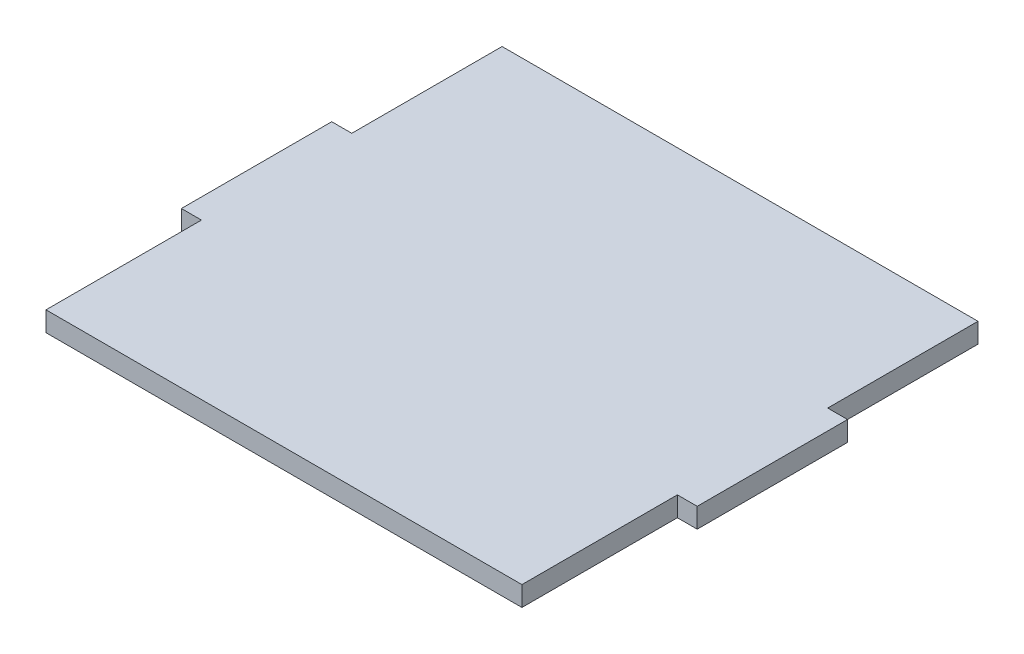
ISO-10303-21;
HEADER;
FILE_DESCRIPTION(('STEP AP214'),'2;1');
FILE_NAME('part.step','',(''),(''),'','','');
FILE_SCHEMA(('AUTOMOTIVE_DESIGN { 1 0 10303 214 1 1 1 1 }'));
ENDSEC;
DATA;
#1=APPLICATION_CONTEXT('core data for automotive mechanical design processes');
#2=APPLICATION_PROTOCOL_DEFINITION('international standard','automotive_design',2000,#1);
#3=PRODUCT_CONTEXT('',#1,'mechanical');
#4=PRODUCT('Part','Part','',(#3));
#5=PRODUCT_RELATED_PRODUCT_CATEGORY('part','',(#4));
#6=PRODUCT_DEFINITION_FORMATION('','',#4);
#7=PRODUCT_DEFINITION_CONTEXT('part definition',#1,'design');
#8=PRODUCT_DEFINITION('design','',#6,#7);
#9=PRODUCT_DEFINITION_SHAPE('','',#8);
#10=(LENGTH_UNIT() NAMED_UNIT(*) SI_UNIT(.MILLI.,.METRE.));
#11=(NAMED_UNIT(*) PLANE_ANGLE_UNIT() SI_UNIT($,.RADIAN.));
#12=(NAMED_UNIT(*) SI_UNIT($,.STERADIAN.) SOLID_ANGLE_UNIT());
#13=UNCERTAINTY_MEASURE_WITH_UNIT(LENGTH_MEASURE(1.E-05),#10,'distance_accuracy_value','');
#14=(GEOMETRIC_REPRESENTATION_CONTEXT(3) GLOBAL_UNCERTAINTY_ASSIGNED_CONTEXT((#13)) GLOBAL_UNIT_ASSIGNED_CONTEXT((#10,
#11,#12)) REPRESENTATION_CONTEXT('',''));
#15=CARTESIAN_POINT('',(0.,0.,0.));
#16=DIRECTION('',(0.,0.,1.));
#17=DIRECTION('',(1.,0.,0.));
#18=AXIS2_PLACEMENT_3D('',#15,#16,#17);
#19=CARTESIAN_POINT('',(0.,2.,0.));
#20=DIRECTION('',(1.,0.,0.));
#21=DIRECTION('',(0.,0.,-1.));
#22=AXIS2_PLACEMENT_3D('',#19,#20,#21);
#23=PLANE('',#22);
#24=DIRECTION('',(0.,1.,0.));
#25=VECTOR('',#24,1.);
#26=CARTESIAN_POINT('',(0.,0.,-32.8276412098136));
#27=LINE('',#26,#25);
#28=CARTESIAN_POINT('',(0.,0.,-32.8276412098136));
#29=VERTEX_POINT('',#28);
#30=CARTESIAN_POINT('',(0.,2.,-32.8276412098136));
#31=VERTEX_POINT('',#30);
#32=EDGE_CURVE('E213',#29,#31,#27,.T.);
#33=ORIENTED_EDGE('',*,*,#32,.F.);
#34=DIRECTION('',(0.,0.,1.));
#35=VECTOR('',#34,1.);
#36=CARTESIAN_POINT('',(0.,0.,0.));
#37=LINE('',#36,#35);
#38=CARTESIAN_POINT('',(0.,0.,-17.6723587901864));
#39=VERTEX_POINT('',#38);
#40=EDGE_CURVE('E136',#29,#39,#37,.T.);
#41=ORIENTED_EDGE('',*,*,#40,.T.);
#42=DIRECTION('',(0.,-1.,0.));
#43=VECTOR('',#42,1.);
#44=CARTESIAN_POINT('',(0.,0.,-17.6723587901864));
#45=LINE('',#44,#43);
#46=CARTESIAN_POINT('',(0.,2.,-17.6723587901864));
#47=VERTEX_POINT('',#46);
#48=EDGE_CURVE('E228',#47,#39,#45,.T.);
#49=ORIENTED_EDGE('',*,*,#48,.F.);
#50=DIRECTION('',(0.,0.,1.));
#51=VECTOR('',#50,1.);
#52=CARTESIAN_POINT('',(0.,2.,0.));
#53=LINE('',#52,#51);
#54=EDGE_CURVE('E40',#31,#47,#53,.T.);
#55=ORIENTED_EDGE('',*,*,#54,.F.);
#56=EDGE_LOOP('',(#33,#41,#49,#55));
#57=FACE_BOUND('',#56,.T.);
#58=ADVANCED_FACE('F32',(#57),#23,.F.);
#59=CARTESIAN_POINT('',(52.,2.,0.));
#60=DIRECTION('',(-1.,0.,0.));
#61=DIRECTION('',(0.,0.,1.));
#62=AXIS2_PLACEMENT_3D('',#59,#60,#61);
#63=PLANE('',#62);
#64=DIRECTION('',(0.,-1.,0.));
#65=VECTOR('',#64,1.);
#66=CARTESIAN_POINT('',(52.,2.,-32.8276412098136));
#67=LINE('',#66,#65);
#68=CARTESIAN_POINT('',(52.,2.,-32.8276412098136));
#69=VERTEX_POINT('',#68);
#70=CARTESIAN_POINT('',(52.,0.,-32.8276412098136));
#71=VERTEX_POINT('',#70);
#72=EDGE_CURVE('E164',#69,#71,#67,.T.);
#73=ORIENTED_EDGE('',*,*,#72,.F.);
#74=DIRECTION('',(0.,0.,-1.));
#75=VECTOR('',#74,1.);
#76=CARTESIAN_POINT('',(52.,2.,0.));
#77=LINE('',#76,#75);
#78=CARTESIAN_POINT('',(52.,2.,-17.6723587901864));
#79=VERTEX_POINT('',#78);
#80=EDGE_CURVE('E11',#79,#69,#77,.T.);
#81=ORIENTED_EDGE('',*,*,#80,.F.);
#82=DIRECTION('',(0.,1.,0.));
#83=VECTOR('',#82,1.);
#84=CARTESIAN_POINT('',(52.,2.,-17.6723587901864));
#85=LINE('',#84,#83);
#86=CARTESIAN_POINT('',(52.,0.,-17.6723587901864));
#87=VERTEX_POINT('',#86);
#88=EDGE_CURVE('E154',#87,#79,#85,.T.);
#89=ORIENTED_EDGE('',*,*,#88,.F.);
#90=DIRECTION('',(0.,0.,-1.));
#91=VECTOR('',#90,1.);
#92=CARTESIAN_POINT('',(52.,0.,0.));
#93=LINE('',#92,#91);
#94=EDGE_CURVE('E35',#87,#71,#93,.T.);
#95=ORIENTED_EDGE('',*,*,#94,.T.);
#96=EDGE_LOOP('',(#73,#81,#89,#95));
#97=FACE_BOUND('',#96,.T.);
#98=ADVANCED_FACE('F181',(#97),#63,.F.);
#99=CARTESIAN_POINT('',(0.,2.,0.));
#100=DIRECTION('',(0.,-1.,0.));
#101=DIRECTION('',(0.,0.,-1.));
#102=AXIS2_PLACEMENT_3D('',#99,#100,#101);
#103=PLANE('',#102);
#104=DIRECTION('',(1.,0.,0.));
#105=VECTOR('',#104,1.);
#106=CARTESIAN_POINT('',(0.,2.,-47.98));
#107=LINE('',#106,#105);
#108=CARTESIAN_POINT('',(2.02,2.,-47.98));
#109=VERTEX_POINT('',#108);
#110=CARTESIAN_POINT('',(50.,2.,-47.98));
#111=VERTEX_POINT('',#110);
#112=EDGE_CURVE('E137',#109,#111,#107,.T.);
#113=ORIENTED_EDGE('',*,*,#112,.F.);
#114=DIRECTION('',(0.,0.,-1.));
#115=VECTOR('',#114,1.);
#116=CARTESIAN_POINT('',(2.02,2.,0.));
#117=LINE('',#116,#115);
#118=CARTESIAN_POINT('',(2.02,2.,-32.8276412098136));
#119=VERTEX_POINT('',#118);
#120=EDGE_CURVE('E152',#119,#109,#117,.T.);
#121=ORIENTED_EDGE('',*,*,#120,.F.);
#122=DIRECTION('',(1.,0.,0.));
#123=VECTOR('',#122,1.);
#124=CARTESIAN_POINT('',(0.,2.,-32.8276412098136));
#125=LINE('',#124,#123);
#126=EDGE_CURVE('E157',#31,#119,#125,.T.);
#127=ORIENTED_EDGE('',*,*,#126,.F.);
#128=ORIENTED_EDGE('',*,*,#54,.T.);
#129=DIRECTION('',(-1.,0.,0.));
#130=VECTOR('',#129,1.);
#131=CARTESIAN_POINT('',(0.,2.,-17.6723587901864));
#132=LINE('',#131,#130);
#133=CARTESIAN_POINT('',(2.02,2.,-17.6723587901864));
#134=VERTEX_POINT('',#133);
#135=EDGE_CURVE('E150',#134,#47,#132,.T.);
#136=ORIENTED_EDGE('',*,*,#135,.F.);
#137=CARTESIAN_POINT('',(2.02,2.,-2.));
#138=VERTEX_POINT('',#137);
#139=EDGE_CURVE('E142',#138,#134,#117,.T.);
#140=ORIENTED_EDGE('',*,*,#139,.F.);
#141=DIRECTION('',(1.,0.,0.));
#142=VECTOR('',#141,1.);
#143=CARTESIAN_POINT('',(0.,2.,-2.));
#144=LINE('',#143,#142);
#145=CARTESIAN_POINT('',(50.,2.,-2.));
#146=VERTEX_POINT('',#145);
#147=EDGE_CURVE('E126',#138,#146,#144,.T.);
#148=ORIENTED_EDGE('',*,*,#147,.T.);
#149=DIRECTION('',(0.,0.,-1.));
#150=VECTOR('',#149,1.);
#151=CARTESIAN_POINT('',(50.,2.,0.));
#152=LINE('',#151,#150);
#153=CARTESIAN_POINT('',(50.,2.,-17.6723587901864));
#154=VERTEX_POINT('',#153);
#155=EDGE_CURVE('E169',#146,#154,#152,.T.);
#156=ORIENTED_EDGE('',*,*,#155,.T.);
#157=DIRECTION('',(-1.,0.,0.));
#158=VECTOR('',#157,1.);
#159=CARTESIAN_POINT('',(0.,2.,-17.6723587901864));
#160=LINE('',#159,#158);
#161=EDGE_CURVE('E151',#79,#154,#160,.T.);
#162=ORIENTED_EDGE('',*,*,#161,.F.);
#163=ORIENTED_EDGE('',*,*,#80,.T.);
#164=DIRECTION('',(1.,0.,0.));
#165=VECTOR('',#164,1.);
#166=CARTESIAN_POINT('',(0.,2.,-32.8276412098136));
#167=LINE('',#166,#165);
#168=CARTESIAN_POINT('',(50.,2.,-32.8276412098136));
#169=VERTEX_POINT('',#168);
#170=EDGE_CURVE('E162',#169,#69,#167,.T.);
#171=ORIENTED_EDGE('',*,*,#170,.F.);
#172=EDGE_CURVE('E166',#169,#111,#152,.T.);
#173=ORIENTED_EDGE('',*,*,#172,.T.);
#174=EDGE_LOOP('',(#113,#121,#127,#128,#136,#140,#148,#156,#162,#163,#171,#173));
#175=FACE_BOUND('',#174,.T.);
#176=ADVANCED_FACE('F148',(#175),#103,.F.);
#177=CARTESIAN_POINT('',(0.,0.,0.));
#178=DIRECTION('',(0.,-1.,0.));
#179=DIRECTION('',(0.,0.,-1.));
#180=AXIS2_PLACEMENT_3D('',#177,#178,#179);
#181=PLANE('',#180);
#182=DIRECTION('',(0.,0.,-1.));
#183=VECTOR('',#182,1.);
#184=CARTESIAN_POINT('',(2.02,0.,0.));
#185=LINE('',#184,#183);
#186=CARTESIAN_POINT('',(2.02,0.,-32.8276412098136));
#187=VERTEX_POINT('',#186);
#188=CARTESIAN_POINT('',(2.02,0.,-47.98));
#189=VERTEX_POINT('',#188);
#190=EDGE_CURVE('E56',#187,#189,#185,.T.);
#191=ORIENTED_EDGE('',*,*,#190,.T.);
#192=DIRECTION('',(1.,0.,0.));
#193=VECTOR('',#192,1.);
#194=CARTESIAN_POINT('',(0.,0.,-47.98));
#195=LINE('',#194,#193);
#196=CARTESIAN_POINT('',(50.,0.,-47.98));
#197=VERTEX_POINT('',#196);
#198=EDGE_CURVE('E224',#189,#197,#195,.T.);
#199=ORIENTED_EDGE('',*,*,#198,.T.);
#200=DIRECTION('',(0.,0.,-1.));
#201=VECTOR('',#200,1.);
#202=CARTESIAN_POINT('',(50.,0.,0.));
#203=LINE('',#202,#201);
#204=CARTESIAN_POINT('',(50.,0.,-32.8276412098136));
#205=VERTEX_POINT('',#204);
#206=EDGE_CURVE('E192',#205,#197,#203,.T.);
#207=ORIENTED_EDGE('',*,*,#206,.F.);
#208=DIRECTION('',(1.,0.,0.));
#209=VECTOR('',#208,1.);
#210=CARTESIAN_POINT('',(50.,0.,-32.8276412098136));
#211=LINE('',#210,#209);
#212=EDGE_CURVE('E190',#205,#71,#211,.T.);
#213=ORIENTED_EDGE('',*,*,#212,.T.);
#214=ORIENTED_EDGE('',*,*,#94,.F.);
#215=DIRECTION('',(1.,0.,0.));
#216=VECTOR('',#215,1.);
#217=CARTESIAN_POINT('',(50.,0.,-17.6723587901864));
#218=LINE('',#217,#216);
#219=CARTESIAN_POINT('',(50.,0.,-17.6723587901864));
#220=VERTEX_POINT('',#219);
#221=EDGE_CURVE('E187',#220,#87,#218,.T.);
#222=ORIENTED_EDGE('',*,*,#221,.F.);
#223=CARTESIAN_POINT('',(50.,0.,-2.));
#224=VERTEX_POINT('',#223);
#225=EDGE_CURVE('E48',#224,#220,#203,.T.);
#226=ORIENTED_EDGE('',*,*,#225,.F.);
#227=DIRECTION('',(1.,0.,0.));
#228=VECTOR('',#227,1.);
#229=CARTESIAN_POINT('',(0.,0.,-2.));
#230=LINE('',#229,#228);
#231=CARTESIAN_POINT('',(2.02,0.,-2.));
#232=VERTEX_POINT('',#231);
#233=EDGE_CURVE('E205',#232,#224,#230,.T.);
#234=ORIENTED_EDGE('',*,*,#233,.F.);
#235=CARTESIAN_POINT('',(2.02,0.,-17.6723587901864));
#236=VERTEX_POINT('',#235);
#237=EDGE_CURVE('E144',#232,#236,#185,.T.);
#238=ORIENTED_EDGE('',*,*,#237,.T.);
#239=DIRECTION('',(1.,0.,0.));
#240=VECTOR('',#239,1.);
#241=CARTESIAN_POINT('',(0.,0.,-17.6723587901864));
#242=LINE('',#241,#240);
#243=EDGE_CURVE('E229',#39,#236,#242,.T.);
#244=ORIENTED_EDGE('',*,*,#243,.F.);
#245=ORIENTED_EDGE('',*,*,#40,.F.);
#246=DIRECTION('',(1.,0.,0.));
#247=VECTOR('',#246,1.);
#248=CARTESIAN_POINT('',(0.,0.,-32.8276412098136));
#249=LINE('',#248,#247);
#250=EDGE_CURVE('E232',#29,#187,#249,.T.);
#251=ORIENTED_EDGE('',*,*,#250,.T.);
#252=EDGE_LOOP('',(#191,#199,#207,#213,#214,#222,#226,#234,#238,#244,#245,#251));
#253=FACE_BOUND('',#252,.T.);
#254=ADVANCED_FACE('F186',(#253),#181,.T.);
#255=CARTESIAN_POINT('',(0.,0.,-17.6723587901864));
#256=DIRECTION('',(0.,0.,1.));
#257=DIRECTION('',(1.,0.,0.));
#258=AXIS2_PLACEMENT_3D('',#255,#256,#257);
#259=PLANE('',#258);
#260=ORIENTED_EDGE('',*,*,#135,.T.);
#261=ORIENTED_EDGE('',*,*,#48,.T.);
#262=ORIENTED_EDGE('',*,*,#243,.T.);
#263=DIRECTION('',(0.,-1.,0.));
#264=VECTOR('',#263,1.);
#265=CARTESIAN_POINT('',(2.02,0.,-17.6723587901864));
#266=LINE('',#265,#264);
#267=EDGE_CURVE('E217',#134,#236,#266,.T.);
#268=ORIENTED_EDGE('',*,*,#267,.F.);
#269=EDGE_LOOP('',(#260,#261,#262,#268));
#270=FACE_BOUND('',#269,.T.);
#271=ADVANCED_FACE('F259',(#270),#259,.T.);
#272=CARTESIAN_POINT('',(2.02,0.,0.));
#273=DIRECTION('',(-1.,0.,0.));
#274=DIRECTION('',(0.,0.,1.));
#275=AXIS2_PLACEMENT_3D('',#272,#273,#274);
#276=PLANE('',#275);
#277=DIRECTION('',(0.,-1.,0.));
#278=VECTOR('',#277,1.);
#279=CARTESIAN_POINT('',(2.02,0.,-2.));
#280=LINE('',#279,#278);
#281=EDGE_CURVE('E129',#138,#232,#280,.T.);
#282=ORIENTED_EDGE('',*,*,#281,.F.);
#283=ORIENTED_EDGE('',*,*,#139,.T.);
#284=ORIENTED_EDGE('',*,*,#267,.T.);
#285=ORIENTED_EDGE('',*,*,#237,.F.);
#286=EDGE_LOOP('',(#282,#283,#284,#285));
#287=FACE_BOUND('',#286,.T.);
#288=ADVANCED_FACE('F140',(#287),#276,.T.);
#289=CARTESIAN_POINT('',(0.,0.,-32.8276412098136));
#290=DIRECTION('',(0.,0.,-1.));
#291=DIRECTION('',(-1.,0.,0.));
#292=AXIS2_PLACEMENT_3D('',#289,#290,#291);
#293=PLANE('',#292);
#294=ORIENTED_EDGE('',*,*,#126,.T.);
#295=DIRECTION('',(0.,1.,0.));
#296=VECTOR('',#295,1.);
#297=CARTESIAN_POINT('',(2.02,0.,-32.8276412098136));
#298=LINE('',#297,#296);
#299=EDGE_CURVE('E211',#187,#119,#298,.T.);
#300=ORIENTED_EDGE('',*,*,#299,.F.);
#301=ORIENTED_EDGE('',*,*,#250,.F.);
#302=ORIENTED_EDGE('',*,*,#32,.T.);
#303=EDGE_LOOP('',(#294,#300,#301,#302));
#304=FACE_BOUND('',#303,.T.);
#305=ADVANCED_FACE('F210',(#304),#293,.T.);
#306=DIRECTION('',(0.,1.,0.));
#307=VECTOR('',#306,1.);
#308=CARTESIAN_POINT('',(2.02,0.,-47.98));
#309=LINE('',#308,#307);
#310=EDGE_CURVE('E145',#189,#109,#309,.T.);
#311=ORIENTED_EDGE('',*,*,#310,.F.);
#312=ORIENTED_EDGE('',*,*,#190,.F.);
#313=ORIENTED_EDGE('',*,*,#299,.T.);
#314=ORIENTED_EDGE('',*,*,#120,.T.);
#315=EDGE_LOOP('',(#311,#312,#313,#314));
#316=FACE_BOUND('',#315,.T.);
#317=ADVANCED_FACE('F216',(#316),#276,.T.);
#318=CARTESIAN_POINT('',(50.,0.,-32.8276412098136));
#319=DIRECTION('',(0.,0.,-1.));
#320=DIRECTION('',(-1.,0.,0.));
#321=AXIS2_PLACEMENT_3D('',#318,#319,#320);
#322=PLANE('',#321);
#323=ORIENTED_EDGE('',*,*,#72,.T.);
#324=ORIENTED_EDGE('',*,*,#212,.F.);
#325=DIRECTION('',(0.,1.,0.));
#326=VECTOR('',#325,1.);
#327=CARTESIAN_POINT('',(50.,0.,-32.8276412098136));
#328=LINE('',#327,#326);
#329=EDGE_CURVE('E237',#205,#169,#328,.T.);
#330=ORIENTED_EDGE('',*,*,#329,.T.);
#331=ORIENTED_EDGE('',*,*,#170,.T.);
#332=EDGE_LOOP('',(#323,#324,#330,#331));
#333=FACE_BOUND('',#332,.T.);
#334=ADVANCED_FACE('F242',(#333),#322,.T.);
#335=CARTESIAN_POINT('',(50.,0.,0.));
#336=DIRECTION('',(-1.,0.,0.));
#337=DIRECTION('',(0.,0.,1.));
#338=AXIS2_PLACEMENT_3D('',#335,#336,#337);
#339=PLANE('',#338);
#340=ORIENTED_EDGE('',*,*,#329,.F.);
#341=ORIENTED_EDGE('',*,*,#206,.T.);
#342=DIRECTION('',(0.,-1.,0.));
#343=VECTOR('',#342,1.);
#344=CARTESIAN_POINT('',(50.,0.,-47.98));
#345=LINE('',#344,#343);
#346=EDGE_CURVE('E202',#111,#197,#345,.T.);
#347=ORIENTED_EDGE('',*,*,#346,.F.);
#348=ORIENTED_EDGE('',*,*,#172,.F.);
#349=EDGE_LOOP('',(#340,#341,#347,#348));
#350=FACE_BOUND('',#349,.T.);
#351=ADVANCED_FACE('F244',(#350),#339,.F.);
#352=CARTESIAN_POINT('',(0.,0.,-47.98));
#353=DIRECTION('',(0.,0.,-1.));
#354=DIRECTION('',(-1.,0.,0.));
#355=AXIS2_PLACEMENT_3D('',#352,#353,#354);
#356=PLANE('',#355);
#357=ORIENTED_EDGE('',*,*,#346,.T.);
#358=ORIENTED_EDGE('',*,*,#198,.F.);
#359=ORIENTED_EDGE('',*,*,#310,.T.);
#360=ORIENTED_EDGE('',*,*,#112,.T.);
#361=EDGE_LOOP('',(#357,#358,#359,#360));
#362=FACE_BOUND('',#361,.T.);
#363=ADVANCED_FACE('F223',(#362),#356,.T.);
#364=CARTESIAN_POINT('',(0.,0.,-2.));
#365=DIRECTION('',(0.,0.,-1.));
#366=DIRECTION('',(-1.,0.,0.));
#367=AXIS2_PLACEMENT_3D('',#364,#365,#366);
#368=PLANE('',#367);
#369=DIRECTION('',(0.,1.,0.));
#370=VECTOR('',#369,1.);
#371=CARTESIAN_POINT('',(50.,0.,-2.));
#372=LINE('',#371,#370);
#373=EDGE_CURVE('E131',#224,#146,#372,.T.);
#374=ORIENTED_EDGE('',*,*,#373,.T.);
#375=ORIENTED_EDGE('',*,*,#147,.F.);
#376=ORIENTED_EDGE('',*,*,#281,.T.);
#377=ORIENTED_EDGE('',*,*,#233,.T.);
#378=EDGE_LOOP('',(#374,#375,#376,#377));
#379=FACE_BOUND('',#378,.T.);
#380=ADVANCED_FACE('F128',(#379),#368,.F.);
#381=ORIENTED_EDGE('',*,*,#373,.F.);
#382=ORIENTED_EDGE('',*,*,#225,.T.);
#383=DIRECTION('',(0.,-1.,0.));
#384=VECTOR('',#383,1.);
#385=CARTESIAN_POINT('',(50.,0.,-17.6723587901864));
#386=LINE('',#385,#384);
#387=EDGE_CURVE('E197',#154,#220,#386,.T.);
#388=ORIENTED_EDGE('',*,*,#387,.F.);
#389=ORIENTED_EDGE('',*,*,#155,.F.);
#390=EDGE_LOOP('',(#381,#382,#388,#389));
#391=FACE_BOUND('',#390,.T.);
#392=ADVANCED_FACE('F241',(#391),#339,.F.);
#393=CARTESIAN_POINT('',(50.,0.,-17.6723587901864));
#394=DIRECTION('',(0.,0.,1.));
#395=DIRECTION('',(1.,0.,0.));
#396=AXIS2_PLACEMENT_3D('',#393,#394,#395);
#397=PLANE('',#396);
#398=ORIENTED_EDGE('',*,*,#88,.T.);
#399=ORIENTED_EDGE('',*,*,#161,.T.);
#400=ORIENTED_EDGE('',*,*,#387,.T.);
#401=ORIENTED_EDGE('',*,*,#221,.T.);
#402=EDGE_LOOP('',(#398,#399,#400,#401));
#403=FACE_BOUND('',#402,.T.);
#404=ADVANCED_FACE('F239',(#403),#397,.T.);
#405=CLOSED_SHELL('',(#58,#98,#176,#254,#271,#288,#305,#317,#334,#351,#363,#380,#392,#404));
#406=MANIFOLD_SOLID_BREP('B2',#405);
#407=ADVANCED_BREP_SHAPE_REPRESENTATION('',(#18,#406),#14);
#408=SHAPE_DEFINITION_REPRESENTATION(#9,#407);
ENDSEC;
END-ISO-10303-21;
